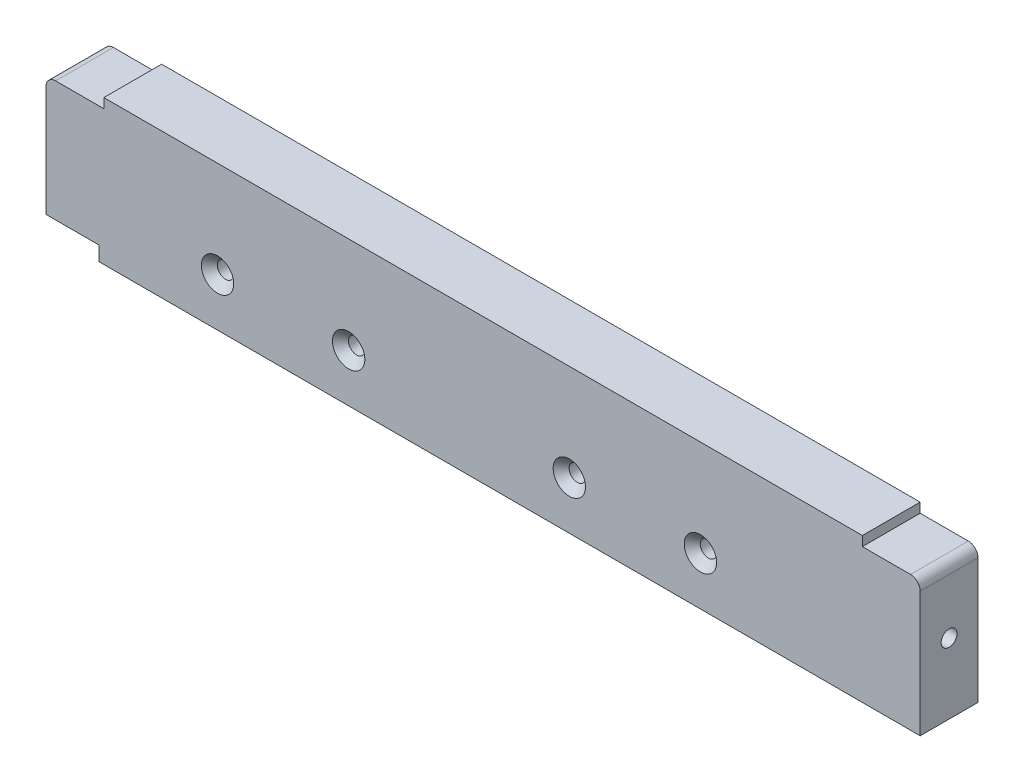
ISO-10303-21;
HEADER;
FILE_DESCRIPTION(('STEP AP214'),'2;1');
FILE_NAME('part.step','',(''),(''),'','','');
FILE_SCHEMA(('AUTOMOTIVE_DESIGN { 1 0 10303 214 1 1 1 1 }'));
ENDSEC;
DATA;
#1=APPLICATION_CONTEXT('core data for automotive mechanical design processes');
#2=APPLICATION_PROTOCOL_DEFINITION('international standard','automotive_design',2000,#1);
#3=PRODUCT_CONTEXT('',#1,'mechanical');
#4=PRODUCT('Part','Part','',(#3));
#5=PRODUCT_RELATED_PRODUCT_CATEGORY('part','',(#4));
#6=PRODUCT_DEFINITION_FORMATION('','',#4);
#7=PRODUCT_DEFINITION_CONTEXT('part definition',#1,'design');
#8=PRODUCT_DEFINITION('design','',#6,#7);
#9=PRODUCT_DEFINITION_SHAPE('','',#8);
#10=(LENGTH_UNIT() NAMED_UNIT(*) SI_UNIT(.MILLI.,.METRE.));
#11=(NAMED_UNIT(*) PLANE_ANGLE_UNIT() SI_UNIT($,.RADIAN.));
#12=(NAMED_UNIT(*) SI_UNIT($,.STERADIAN.) SOLID_ANGLE_UNIT());
#13=UNCERTAINTY_MEASURE_WITH_UNIT(LENGTH_MEASURE(1.E-05),#10,'distance_accuracy_value','');
#14=(GEOMETRIC_REPRESENTATION_CONTEXT(3) GLOBAL_UNCERTAINTY_ASSIGNED_CONTEXT((#13)) GLOBAL_UNIT_ASSIGNED_CONTEXT((#10,
#11,#12)) REPRESENTATION_CONTEXT('',''));
#15=CARTESIAN_POINT('',(0.,0.,0.));
#16=DIRECTION('',(0.,0.,1.));
#17=DIRECTION('',(1.,0.,0.));
#18=AXIS2_PLACEMENT_3D('',#15,#16,#17);
#19=CARTESIAN_POINT('',(-89.0193885765125,199.92784972707,0.));
#20=DIRECTION('',(-1.,0.,0.));
#21=DIRECTION('',(0.,0.,1.));
#22=AXIS2_PLACEMENT_3D('',#19,#20,#21);
#23=PLANE('',#22);
#24=CARTESIAN_POINT('',(-89.0193885765125,184.67784972707,6.));
#25=DIRECTION('',(-1.,0.,0.));
#26=DIRECTION('',(0.,0.,1.));
#27=AXIS2_PLACEMENT_3D('',#24,#25,#26);
#28=CIRCLE('',#27,1.64999999999998);
#29=CARTESIAN_POINT('',(-89.0193885765125,184.67784972707,7.64999999999999));
#30=VERTEX_POINT('',#29);
#31=EDGE_CURVE('E156',#30,#30,#28,.T.);
#32=ORIENTED_EDGE('',*,*,#31,.F.);
#33=EDGE_LOOP('',(#32));
#34=FACE_BOUND('',#33,.T.);
#35=DIRECTION('',(0.,0.,-1.));
#36=VECTOR('',#35,1.);
#37=CARTESIAN_POINT('',(-89.0193885765125,172.92784972707,0.));
#38=LINE('',#37,#36);
#39=CARTESIAN_POINT('',(-89.0193885765125,172.92784972707,12.));
#40=VERTEX_POINT('',#39);
#41=CARTESIAN_POINT('',(-89.0193885765125,172.92784972707,0.));
#42=VERTEX_POINT('',#41);
#43=EDGE_CURVE('E164',#40,#42,#38,.T.);
#44=ORIENTED_EDGE('',*,*,#43,.F.);
#45=DIRECTION('',(0.,-1.,0.));
#46=VECTOR('',#45,1.);
#47=CARTESIAN_POINT('',(-89.0193885765125,199.92784972707,12.));
#48=LINE('',#47,#46);
#49=CARTESIAN_POINT('',(-89.0193885765125,195.92784972707,12.));
#50=VERTEX_POINT('',#49);
#51=EDGE_CURVE('E204',#50,#40,#48,.T.);
#52=ORIENTED_EDGE('',*,*,#51,.F.);
#53=DIRECTION('',(0.,0.,1.));
#54=VECTOR('',#53,1.);
#55=CARTESIAN_POINT('',(-89.0193885765125,195.92784972707,0.));
#56=LINE('',#55,#54);
#57=CARTESIAN_POINT('',(-89.0193885765125,195.92784972707,0.));
#58=VERTEX_POINT('',#57);
#59=EDGE_CURVE('E259',#50,#58,#56,.F.);
#60=ORIENTED_EDGE('',*,*,#59,.T.);
#61=DIRECTION('',(0.,-1.,0.));
#62=VECTOR('',#61,1.);
#63=CARTESIAN_POINT('',(-89.0193885765125,199.92784972707,0.));
#64=LINE('',#63,#62);
#65=EDGE_CURVE('E205',#58,#42,#64,.T.);
#66=ORIENTED_EDGE('',*,*,#65,.T.);
#67=EDGE_LOOP('',(#44,#52,#60,#66));
#68=FACE_BOUND('',#67,.T.);
#69=ADVANCED_FACE('F35',(#34,#68),#23,.T.);
#70=CARTESIAN_POINT('',(-62.8193885765124,169.92784972707,12.));
#71=DIRECTION('',(0.,1.,0.));
#72=DIRECTION('',(0.,0.,1.));
#73=AXIS2_PLACEMENT_3D('',#70,#71,#72);
#74=PLANE('',#73);
#75=DIRECTION('',(1.,0.,0.));
#76=VECTOR('',#75,1.);
#77=CARTESIAN_POINT('',(-62.8193885765124,169.92784972707,12.));
#78=LINE('',#77,#76);
#79=CARTESIAN_POINT('',(-78.0193885765125,169.92784972707,12.));
#80=VERTEX_POINT('',#79);
#81=CARTESIAN_POINT('',(92.3806114234876,169.92784972707,12.));
#82=VERTEX_POINT('',#81);
#83=EDGE_CURVE('E247',#80,#82,#78,.T.);
#84=ORIENTED_EDGE('',*,*,#83,.F.);
#85=DIRECTION('',(0.,0.,1.));
#86=VECTOR('',#85,1.);
#87=CARTESIAN_POINT('',(-78.0193885765125,169.92784972707,0.));
#88=LINE('',#87,#86);
#89=CARTESIAN_POINT('',(-78.0193885765125,169.92784972707,0.));
#90=VERTEX_POINT('',#89);
#91=EDGE_CURVE('E163',#90,#80,#88,.T.);
#92=ORIENTED_EDGE('',*,*,#91,.F.);
#93=DIRECTION('',(1.,0.,0.));
#94=VECTOR('',#93,1.);
#95=CARTESIAN_POINT('',(-62.8193885765124,169.92784972707,0.));
#96=LINE('',#95,#94);
#97=CARTESIAN_POINT('',(92.3806114234876,169.92784972707,0.));
#98=VERTEX_POINT('',#97);
#99=EDGE_CURVE('E246',#90,#98,#96,.T.);
#100=ORIENTED_EDGE('',*,*,#99,.T.);
#101=DIRECTION('',(0.,0.,-1.));
#102=VECTOR('',#101,1.);
#103=CARTESIAN_POINT('',(92.3806114234876,169.92784972707,12.));
#104=LINE('',#103,#102);
#105=EDGE_CURVE('E200',#82,#98,#104,.T.);
#106=ORIENTED_EDGE('',*,*,#105,.F.);
#107=EDGE_LOOP('',(#84,#92,#100,#106));
#108=FACE_BOUND('',#107,.T.);
#109=ADVANCED_FACE('F314',(#108),#74,.F.);
#110=CARTESIAN_POINT('',(-62.8193885765125,199.92784972707,12.));
#111=DIRECTION('',(0.,-1.,0.));
#112=DIRECTION('',(0.,0.,-1.));
#113=AXIS2_PLACEMENT_3D('',#110,#111,#112);
#114=PLANE('',#113);
#115=DIRECTION('',(-1.,0.,0.));
#116=VECTOR('',#115,1.);
#117=CARTESIAN_POINT('',(-62.8193885765125,199.92784972707,12.));
#118=LINE('',#117,#116);
#119=CARTESIAN_POINT('',(80.3806114234876,199.92784972707,12.));
#120=VERTEX_POINT('',#119);
#121=CARTESIAN_POINT('',(-77.0193885765125,199.92784972707,12.));
#122=VERTEX_POINT('',#121);
#123=EDGE_CURVE('E249',#120,#122,#118,.T.);
#124=ORIENTED_EDGE('',*,*,#123,.F.);
#125=DIRECTION('',(0.,0.,1.));
#126=VECTOR('',#125,1.);
#127=CARTESIAN_POINT('',(80.3806114234876,199.92784972707,0.));
#128=LINE('',#127,#126);
#129=CARTESIAN_POINT('',(80.3806114234876,199.92784972707,0.));
#130=VERTEX_POINT('',#129);
#131=EDGE_CURVE('E137',#130,#120,#128,.T.);
#132=ORIENTED_EDGE('',*,*,#131,.F.);
#133=DIRECTION('',(-1.,0.,0.));
#134=VECTOR('',#133,1.);
#135=CARTESIAN_POINT('',(-62.8193885765125,199.92784972707,0.));
#136=LINE('',#135,#134);
#137=CARTESIAN_POINT('',(-77.0193885765125,199.92784972707,0.));
#138=VERTEX_POINT('',#137);
#139=EDGE_CURVE('E250',#130,#138,#136,.T.);
#140=ORIENTED_EDGE('',*,*,#139,.T.);
#141=DIRECTION('',(0.,0.,-1.));
#142=VECTOR('',#141,1.);
#143=CARTESIAN_POINT('',(-77.0193885765125,199.92784972707,0.));
#144=LINE('',#143,#142);
#145=EDGE_CURVE('E179',#122,#138,#144,.T.);
#146=ORIENTED_EDGE('',*,*,#145,.F.);
#147=EDGE_LOOP('',(#124,#132,#140,#146));
#148=FACE_BOUND('',#147,.T.);
#149=ADVANCED_FACE('F281',(#148),#114,.F.);
#150=CARTESIAN_POINT('',(-62.8193885765124,169.92784972707,12.));
#151=DIRECTION('',(0.,0.,1.));
#152=DIRECTION('',(1.,0.,0.));
#153=AXIS2_PLACEMENT_3D('',#150,#151,#152);
#154=PLANE('',#153);
#155=DIRECTION('',(0.,1.,0.));
#156=VECTOR('',#155,1.);
#157=CARTESIAN_POINT('',(92.3806114234876,199.92784972707,12.));
#158=LINE('',#157,#156);
#159=CARTESIAN_POINT('',(92.3806114234876,195.92784972707,12.));
#160=VERTEX_POINT('',#159);
#161=EDGE_CURVE('E198',#82,#160,#158,.T.);
#162=ORIENTED_EDGE('',*,*,#161,.T.);
#163=CARTESIAN_POINT('',(90.3806114234876,195.92784972707,12.));
#164=DIRECTION('',(0.,0.,1.));
#165=DIRECTION('',(1.,0.,0.));
#166=AXIS2_PLACEMENT_3D('',#163,#164,#165);
#167=CIRCLE('',#166,2.);
#168=CARTESIAN_POINT('',(90.3806114234876,197.92784972707,12.));
#169=VERTEX_POINT('',#168);
#170=EDGE_CURVE('E11',#160,#169,#167,.T.);
#171=ORIENTED_EDGE('',*,*,#170,.T.);
#172=DIRECTION('',(1.,0.,0.));
#173=VECTOR('',#172,1.);
#174=CARTESIAN_POINT('',(92.3806114234876,197.92784972707,12.));
#175=LINE('',#174,#173);
#176=CARTESIAN_POINT('',(80.3806114234876,197.92784972707,12.));
#177=VERTEX_POINT('',#176);
#178=EDGE_CURVE('E149',#177,#169,#175,.T.);
#179=ORIENTED_EDGE('',*,*,#178,.F.);
#180=DIRECTION('',(0.,1.,0.));
#181=VECTOR('',#180,1.);
#182=CARTESIAN_POINT('',(80.3806114234876,197.92784972707,12.));
#183=LINE('',#182,#181);
#184=EDGE_CURVE('E153',#177,#120,#183,.T.);
#185=ORIENTED_EDGE('',*,*,#184,.T.);
#186=ORIENTED_EDGE('',*,*,#123,.T.);
#187=DIRECTION('',(0.,1.,0.));
#188=VECTOR('',#187,1.);
#189=CARTESIAN_POINT('',(-77.0193885765125,197.92784972707,12.));
#190=LINE('',#189,#188);
#191=CARTESIAN_POINT('',(-77.0193885765125,197.92784972707,12.));
#192=VERTEX_POINT('',#191);
#193=EDGE_CURVE('E189',#192,#122,#190,.T.);
#194=ORIENTED_EDGE('',*,*,#193,.F.);
#195=DIRECTION('',(1.,0.,0.));
#196=VECTOR('',#195,1.);
#197=CARTESIAN_POINT('',(-89.0193885765125,197.92784972707,12.));
#198=LINE('',#197,#196);
#199=CARTESIAN_POINT('',(-87.0193885765125,197.92784972707,12.));
#200=VERTEX_POINT('',#199);
#201=EDGE_CURVE('E181',#200,#192,#198,.T.);
#202=ORIENTED_EDGE('',*,*,#201,.F.);
#203=CARTESIAN_POINT('',(-87.0193885765125,195.92784972707,12.));
#204=DIRECTION('',(0.,0.,1.));
#205=DIRECTION('',(1.,0.,0.));
#206=AXIS2_PLACEMENT_3D('',#203,#204,#205);
#207=CIRCLE('',#206,2.);
#208=EDGE_CURVE('E257',#200,#50,#207,.T.);
#209=ORIENTED_EDGE('',*,*,#208,.T.);
#210=ORIENTED_EDGE('',*,*,#51,.T.);
#211=DIRECTION('',(-1.,0.,0.));
#212=VECTOR('',#211,1.);
#213=CARTESIAN_POINT('',(-89.0193885765125,172.92784972707,12.));
#214=LINE('',#213,#212);
#215=CARTESIAN_POINT('',(-78.0193885765125,172.92784972707,12.));
#216=VERTEX_POINT('',#215);
#217=EDGE_CURVE('E172',#216,#40,#214,.T.);
#218=ORIENTED_EDGE('',*,*,#217,.F.);
#219=DIRECTION('',(0.,-1.,0.));
#220=VECTOR('',#219,1.);
#221=CARTESIAN_POINT('',(-78.0193885765125,172.92784972707,12.));
#222=LINE('',#221,#220);
#223=EDGE_CURVE('E176',#216,#80,#222,.T.);
#224=ORIENTED_EDGE('',*,*,#223,.T.);
#225=ORIENTED_EDGE('',*,*,#83,.T.);
#226=EDGE_LOOP('',(#162,#171,#179,#185,#186,#194,#202,#209,#210,#218,#224,#225));
#227=FACE_BOUND('',#226,.T.);
#228=CARTESIAN_POINT('',(46.7806114234876,179.92784972707,12.));
#229=DIRECTION('',(0.,0.,1.));
#230=DIRECTION('',(1.,0.,0.));
#231=AXIS2_PLACEMENT_3D('',#228,#229,#230);
#232=CIRCLE('',#231,3.36);
#233=CARTESIAN_POINT('',(50.1406114234876,179.92784972707,12.));
#234=VERTEX_POINT('',#233);
#235=EDGE_CURVE('E208',#234,#234,#232,.T.);
#236=ORIENTED_EDGE('',*,*,#235,.F.);
#237=EDGE_LOOP('',(#236));
#238=FACE_BOUND('',#237,.T.);
#239=CARTESIAN_POINT('',(-53.4193885765125,179.92784972707,12.));
#240=DIRECTION('',(0.,0.,1.));
#241=DIRECTION('',(1.,0.,0.));
#242=AXIS2_PLACEMENT_3D('',#239,#240,#241);
#243=CIRCLE('',#242,3.36);
#244=CARTESIAN_POINT('',(-50.0593885765125,179.92784972707,12.));
#245=VERTEX_POINT('',#244);
#246=EDGE_CURVE('E219',#245,#245,#243,.T.);
#247=ORIENTED_EDGE('',*,*,#246,.F.);
#248=EDGE_LOOP('',(#247));
#249=FACE_BOUND('',#248,.T.);
#250=CARTESIAN_POINT('',(-26.2193885765125,179.92784972707,12.));
#251=DIRECTION('',(0.,0.,1.));
#252=DIRECTION('',(1.,0.,0.));
#253=AXIS2_PLACEMENT_3D('',#250,#251,#252);
#254=CIRCLE('',#253,3.36);
#255=CARTESIAN_POINT('',(-22.8593885765125,179.92784972707,12.));
#256=VERTEX_POINT('',#255);
#257=EDGE_CURVE('E228',#256,#256,#254,.T.);
#258=ORIENTED_EDGE('',*,*,#257,.F.);
#259=EDGE_LOOP('',(#258));
#260=FACE_BOUND('',#259,.T.);
#261=CARTESIAN_POINT('',(19.5806114234876,179.92784972707,12.));
#262=DIRECTION('',(0.,0.,1.));
#263=DIRECTION('',(1.,0.,0.));
#264=AXIS2_PLACEMENT_3D('',#261,#262,#263);
#265=CIRCLE('',#264,3.36);
#266=CARTESIAN_POINT('',(22.9406114234876,179.92784972707,12.));
#267=VERTEX_POINT('',#266);
#268=EDGE_CURVE('E237',#267,#267,#265,.T.);
#269=ORIENTED_EDGE('',*,*,#268,.F.);
#270=EDGE_LOOP('',(#269));
#271=FACE_BOUND('',#270,.T.);
#272=ADVANCED_FACE('F285',(#227,#238,#249,#260,#271),#154,.T.);
#273=CARTESIAN_POINT('',(-62.8193885765124,169.92784972707,0.));
#274=DIRECTION('',(0.,0.,1.));
#275=DIRECTION('',(1.,0.,0.));
#276=AXIS2_PLACEMENT_3D('',#273,#274,#275);
#277=PLANE('',#276);
#278=CARTESIAN_POINT('',(46.7806114234876,179.92784972707,0.));
#279=DIRECTION('',(0.,0.,1.));
#280=DIRECTION('',(1.,0.,0.));
#281=AXIS2_PLACEMENT_3D('',#278,#279,#280);
#282=CIRCLE('',#281,1.69999999999999);
#283=CARTESIAN_POINT('',(48.4806114234876,179.92784972707,0.));
#284=VERTEX_POINT('',#283);
#285=EDGE_CURVE('E216',#284,#284,#282,.T.);
#286=ORIENTED_EDGE('',*,*,#285,.T.);
#287=EDGE_LOOP('',(#286));
#288=FACE_BOUND('',#287,.T.);
#289=CARTESIAN_POINT('',(-53.4193885765125,179.92784972707,0.));
#290=DIRECTION('',(0.,0.,1.));
#291=DIRECTION('',(1.,0.,0.));
#292=AXIS2_PLACEMENT_3D('',#289,#290,#291);
#293=CIRCLE('',#292,1.69999999999999);
#294=CARTESIAN_POINT('',(-51.7193885765125,179.92784972707,0.));
#295=VERTEX_POINT('',#294);
#296=EDGE_CURVE('E225',#295,#295,#293,.T.);
#297=ORIENTED_EDGE('',*,*,#296,.T.);
#298=EDGE_LOOP('',(#297));
#299=FACE_BOUND('',#298,.T.);
#300=CARTESIAN_POINT('',(-26.2193885765125,179.92784972707,0.));
#301=DIRECTION('',(0.,0.,1.));
#302=DIRECTION('',(1.,0.,0.));
#303=AXIS2_PLACEMENT_3D('',#300,#301,#302);
#304=CIRCLE('',#303,1.69999999999999);
#305=CARTESIAN_POINT('',(-24.5193885765125,179.92784972707,0.));
#306=VERTEX_POINT('',#305);
#307=EDGE_CURVE('E234',#306,#306,#304,.T.);
#308=ORIENTED_EDGE('',*,*,#307,.T.);
#309=EDGE_LOOP('',(#308));
#310=FACE_BOUND('',#309,.T.);
#311=CARTESIAN_POINT('',(19.5806114234876,179.92784972707,0.));
#312=DIRECTION('',(0.,0.,1.));
#313=DIRECTION('',(1.,0.,0.));
#314=AXIS2_PLACEMENT_3D('',#311,#312,#313);
#315=CIRCLE('',#314,1.69999999999999);
#316=CARTESIAN_POINT('',(21.2806114234875,179.92784972707,0.));
#317=VERTEX_POINT('',#316);
#318=EDGE_CURVE('E243',#317,#317,#315,.T.);
#319=ORIENTED_EDGE('',*,*,#318,.T.);
#320=EDGE_LOOP('',(#319));
#321=FACE_BOUND('',#320,.T.);
#322=DIRECTION('',(-1.,0.,0.));
#323=VECTOR('',#322,1.);
#324=CARTESIAN_POINT('',(92.3806114234876,197.92784972707,0.));
#325=LINE('',#324,#323);
#326=CARTESIAN_POINT('',(90.3806114234876,197.92784972707,0.));
#327=VERTEX_POINT('',#326);
#328=CARTESIAN_POINT('',(80.3806114234876,197.92784972707,0.));
#329=VERTEX_POINT('',#328);
#330=EDGE_CURVE('E140',#327,#329,#325,.T.);
#331=ORIENTED_EDGE('',*,*,#330,.F.);
#332=CARTESIAN_POINT('',(90.3806114234876,195.92784972707,0.));
#333=DIRECTION('',(0.,0.,1.));
#334=DIRECTION('',(1.,0.,0.));
#335=AXIS2_PLACEMENT_3D('',#332,#333,#334);
#336=CIRCLE('',#335,2.);
#337=CARTESIAN_POINT('',(92.3806114234876,195.92784972707,0.));
#338=VERTEX_POINT('',#337);
#339=EDGE_CURVE('E57',#327,#338,#336,.F.);
#340=ORIENTED_EDGE('',*,*,#339,.T.);
#341=DIRECTION('',(0.,1.,0.));
#342=VECTOR('',#341,1.);
#343=CARTESIAN_POINT('',(92.3806114234876,199.92784972707,0.));
#344=LINE('',#343,#342);
#345=EDGE_CURVE('E195',#98,#338,#344,.T.);
#346=ORIENTED_EDGE('',*,*,#345,.F.);
#347=ORIENTED_EDGE('',*,*,#99,.F.);
#348=DIRECTION('',(0.,-1.,0.));
#349=VECTOR('',#348,1.);
#350=CARTESIAN_POINT('',(-78.0193885765125,172.92784972707,0.));
#351=LINE('',#350,#349);
#352=CARTESIAN_POINT('',(-78.0193885765125,172.92784972707,0.));
#353=VERTEX_POINT('',#352);
#354=EDGE_CURVE('E174',#353,#90,#351,.T.);
#355=ORIENTED_EDGE('',*,*,#354,.F.);
#356=DIRECTION('',(1.,0.,0.));
#357=VECTOR('',#356,1.);
#358=CARTESIAN_POINT('',(-89.0193885765125,172.92784972707,0.));
#359=LINE('',#358,#357);
#360=EDGE_CURVE('E166',#42,#353,#359,.T.);
#361=ORIENTED_EDGE('',*,*,#360,.F.);
#362=ORIENTED_EDGE('',*,*,#65,.F.);
#363=CARTESIAN_POINT('',(-87.0193885765125,195.92784972707,0.));
#364=DIRECTION('',(0.,0.,1.));
#365=DIRECTION('',(1.,0.,0.));
#366=AXIS2_PLACEMENT_3D('',#363,#364,#365);
#367=CIRCLE('',#366,2.);
#368=CARTESIAN_POINT('',(-87.0193885765125,197.92784972707,0.));
#369=VERTEX_POINT('',#368);
#370=EDGE_CURVE('E261',#58,#369,#367,.F.);
#371=ORIENTED_EDGE('',*,*,#370,.T.);
#372=DIRECTION('',(-1.,0.,0.));
#373=VECTOR('',#372,1.);
#374=CARTESIAN_POINT('',(-89.0193885765125,197.92784972707,0.));
#375=LINE('',#374,#373);
#376=CARTESIAN_POINT('',(-77.0193885765125,197.92784972707,0.));
#377=VERTEX_POINT('',#376);
#378=EDGE_CURVE('E186',#377,#369,#375,.T.);
#379=ORIENTED_EDGE('',*,*,#378,.F.);
#380=DIRECTION('',(0.,1.,0.));
#381=VECTOR('',#380,1.);
#382=CARTESIAN_POINT('',(-77.0193885765125,197.92784972707,0.));
#383=LINE('',#382,#381);
#384=EDGE_CURVE('E192',#377,#138,#383,.T.);
#385=ORIENTED_EDGE('',*,*,#384,.T.);
#386=ORIENTED_EDGE('',*,*,#139,.F.);
#387=DIRECTION('',(0.,1.,0.));
#388=VECTOR('',#387,1.);
#389=CARTESIAN_POINT('',(80.3806114234876,197.92784972707,0.));
#390=LINE('',#389,#388);
#391=EDGE_CURVE('E151',#329,#130,#390,.T.);
#392=ORIENTED_EDGE('',*,*,#391,.F.);
#393=EDGE_LOOP('',(#331,#340,#346,#347,#355,#361,#362,#371,#379,#385,#386,#392));
#394=FACE_BOUND('',#393,.T.);
#395=ADVANCED_FACE('F274',(#288,#299,#310,#321,#394),#277,.F.);
#396=CARTESIAN_POINT('',(19.5806114234876,179.92784972707,12.));
#397=DIRECTION('',(0.,0.,1.));
#398=DIRECTION('',(1.,0.,0.));
#399=AXIS2_PLACEMENT_3D('',#396,#397,#398);
#400=CYLINDRICAL_SURFACE('',#399,1.69999999999999);
#401=ORIENTED_EDGE('',*,*,#318,.F.);
#402=EDGE_LOOP('',(#401));
#403=FACE_BOUND('',#402,.T.);
#404=CARTESIAN_POINT('',(19.5806114234876,179.92784972707,10.34));
#405=DIRECTION('',(0.,0.,1.));
#406=DIRECTION('',(1.,0.,0.));
#407=AXIS2_PLACEMENT_3D('',#404,#405,#406);
#408=CIRCLE('',#407,1.7);
#409=CARTESIAN_POINT('',(21.2806114234876,179.92784972707,10.34));
#410=VERTEX_POINT('',#409);
#411=EDGE_CURVE('E240',#410,#410,#408,.T.);
#412=ORIENTED_EDGE('',*,*,#411,.T.);
#413=EDGE_LOOP('',(#412));
#414=FACE_BOUND('',#413,.T.);
#415=ADVANCED_FACE('F360',(#403,#414),#400,.F.);
#416=CARTESIAN_POINT('',(19.5806114234876,179.92784972707,12.));
#417=DIRECTION('',(0.,0.,1.));
#418=DIRECTION('',(1.,0.,0.));
#419=AXIS2_PLACEMENT_3D('',#416,#417,#418);
#420=CONICAL_SURFACE('',#419,3.36,0.78539816339745);
#421=ORIENTED_EDGE('',*,*,#411,.F.);
#422=EDGE_LOOP('',(#421));
#423=FACE_BOUND('',#422,.T.);
#424=ORIENTED_EDGE('',*,*,#268,.T.);
#425=EDGE_LOOP('',(#424));
#426=FACE_BOUND('',#425,.T.);
#427=ADVANCED_FACE('F356',(#423,#426),#420,.F.);
#428=CARTESIAN_POINT('',(-26.2193885765125,179.92784972707,12.));
#429=DIRECTION('',(0.,0.,1.));
#430=DIRECTION('',(1.,0.,0.));
#431=AXIS2_PLACEMENT_3D('',#428,#429,#430);
#432=CYLINDRICAL_SURFACE('',#431,1.69999999999999);
#433=ORIENTED_EDGE('',*,*,#307,.F.);
#434=EDGE_LOOP('',(#433));
#435=FACE_BOUND('',#434,.T.);
#436=CARTESIAN_POINT('',(-26.2193885765125,179.92784972707,10.34));
#437=DIRECTION('',(0.,0.,1.));
#438=DIRECTION('',(1.,0.,0.));
#439=AXIS2_PLACEMENT_3D('',#436,#437,#438);
#440=CIRCLE('',#439,1.7);
#441=CARTESIAN_POINT('',(-24.5193885765125,179.92784972707,10.34));
#442=VERTEX_POINT('',#441);
#443=EDGE_CURVE('E231',#442,#442,#440,.T.);
#444=ORIENTED_EDGE('',*,*,#443,.T.);
#445=EDGE_LOOP('',(#444));
#446=FACE_BOUND('',#445,.T.);
#447=ADVANCED_FACE('F352',(#435,#446),#432,.F.);
#448=CARTESIAN_POINT('',(-26.2193885765125,179.92784972707,12.));
#449=DIRECTION('',(0.,0.,1.));
#450=DIRECTION('',(1.,0.,0.));
#451=AXIS2_PLACEMENT_3D('',#448,#449,#450);
#452=CONICAL_SURFACE('',#451,3.36,0.78539816339745);
#453=ORIENTED_EDGE('',*,*,#443,.F.);
#454=EDGE_LOOP('',(#453));
#455=FACE_BOUND('',#454,.T.);
#456=ORIENTED_EDGE('',*,*,#257,.T.);
#457=EDGE_LOOP('',(#456));
#458=FACE_BOUND('',#457,.T.);
#459=ADVANCED_FACE('F348',(#455,#458),#452,.F.);
#460=CARTESIAN_POINT('',(-53.4193885765125,179.92784972707,12.));
#461=DIRECTION('',(0.,0.,1.));
#462=DIRECTION('',(1.,0.,0.));
#463=AXIS2_PLACEMENT_3D('',#460,#461,#462);
#464=CYLINDRICAL_SURFACE('',#463,1.7);
#465=ORIENTED_EDGE('',*,*,#296,.F.);
#466=EDGE_LOOP('',(#465));
#467=FACE_BOUND('',#466,.T.);
#468=CARTESIAN_POINT('',(-53.4193885765125,179.92784972707,10.34));
#469=DIRECTION('',(0.,0.,1.));
#470=DIRECTION('',(1.,0.,0.));
#471=AXIS2_PLACEMENT_3D('',#468,#469,#470);
#472=CIRCLE('',#471,1.7);
#473=CARTESIAN_POINT('',(-51.7193885765125,179.92784972707,10.34));
#474=VERTEX_POINT('',#473);
#475=EDGE_CURVE('E222',#474,#474,#472,.T.);
#476=ORIENTED_EDGE('',*,*,#475,.T.);
#477=EDGE_LOOP('',(#476));
#478=FACE_BOUND('',#477,.T.);
#479=ADVANCED_FACE('F344',(#467,#478),#464,.F.);
#480=CARTESIAN_POINT('',(-53.4193885765125,179.92784972707,12.));
#481=DIRECTION('',(0.,0.,1.));
#482=DIRECTION('',(1.,0.,0.));
#483=AXIS2_PLACEMENT_3D('',#480,#481,#482);
#484=CONICAL_SURFACE('',#483,3.36,0.785398163397449);
#485=ORIENTED_EDGE('',*,*,#475,.F.);
#486=EDGE_LOOP('',(#485));
#487=FACE_BOUND('',#486,.T.);
#488=ORIENTED_EDGE('',*,*,#246,.T.);
#489=EDGE_LOOP('',(#488));
#490=FACE_BOUND('',#489,.T.);
#491=ADVANCED_FACE('F340',(#487,#490),#484,.F.);
#492=CARTESIAN_POINT('',(46.7806114234876,179.92784972707,12.));
#493=DIRECTION('',(0.,0.,1.));
#494=DIRECTION('',(1.,0.,0.));
#495=AXIS2_PLACEMENT_3D('',#492,#493,#494);
#496=CYLINDRICAL_SURFACE('',#495,1.7);
#497=ORIENTED_EDGE('',*,*,#285,.F.);
#498=EDGE_LOOP('',(#497));
#499=FACE_BOUND('',#498,.T.);
#500=CARTESIAN_POINT('',(46.7806114234876,179.92784972707,10.34));
#501=DIRECTION('',(0.,0.,1.));
#502=DIRECTION('',(1.,0.,0.));
#503=AXIS2_PLACEMENT_3D('',#500,#501,#502);
#504=CIRCLE('',#503,1.7);
#505=CARTESIAN_POINT('',(48.4806114234876,179.92784972707,10.34));
#506=VERTEX_POINT('',#505);
#507=EDGE_CURVE('E213',#506,#506,#504,.T.);
#508=ORIENTED_EDGE('',*,*,#507,.T.);
#509=EDGE_LOOP('',(#508));
#510=FACE_BOUND('',#509,.T.);
#511=ADVANCED_FACE('F336',(#499,#510),#496,.F.);
#512=CARTESIAN_POINT('',(46.7806114234876,179.92784972707,12.));
#513=DIRECTION('',(0.,0.,1.));
#514=DIRECTION('',(1.,0.,0.));
#515=AXIS2_PLACEMENT_3D('',#512,#513,#514);
#516=CONICAL_SURFACE('',#515,3.36,0.785398163397449);
#517=ORIENTED_EDGE('',*,*,#507,.F.);
#518=EDGE_LOOP('',(#517));
#519=FACE_BOUND('',#518,.T.);
#520=ORIENTED_EDGE('',*,*,#235,.T.);
#521=EDGE_LOOP('',(#520));
#522=FACE_BOUND('',#521,.T.);
#523=ADVANCED_FACE('F334',(#519,#522),#516,.F.);
#524=CARTESIAN_POINT('',(92.3806114234876,199.92784972707,12.));
#525=DIRECTION('',(-1.,0.,0.));
#526=DIRECTION('',(0.,0.,1.));
#527=AXIS2_PLACEMENT_3D('',#524,#525,#526);
#528=PLANE('',#527);
#529=CARTESIAN_POINT('',(92.3806114234876,184.486290300135,5.99999999999999));
#530=DIRECTION('',(1.,0.,0.));
#531=DIRECTION('',(0.,0.,-1.));
#532=AXIS2_PLACEMENT_3D('',#529,#530,#531);
#533=CIRCLE('',#532,1.64999999999998);
#534=CARTESIAN_POINT('',(92.3806114234876,184.486290300135,4.35000000000001));
#535=VERTEX_POINT('',#534);
#536=EDGE_CURVE('E138',#535,#535,#533,.T.);
#537=ORIENTED_EDGE('',*,*,#536,.F.);
#538=EDGE_LOOP('',(#537));
#539=FACE_BOUND('',#538,.T.);
#540=ORIENTED_EDGE('',*,*,#345,.T.);
#541=DIRECTION('',(0.,0.,-1.));
#542=VECTOR('',#541,1.);
#543=CARTESIAN_POINT('',(92.3806114234876,195.92784972707,12.));
#544=LINE('',#543,#542);
#545=EDGE_CURVE('E43',#338,#160,#544,.F.);
#546=ORIENTED_EDGE('',*,*,#545,.T.);
#547=ORIENTED_EDGE('',*,*,#161,.F.);
#548=ORIENTED_EDGE('',*,*,#105,.T.);
#549=EDGE_LOOP('',(#540,#546,#547,#548));
#550=FACE_BOUND('',#549,.T.);
#551=ADVANCED_FACE('F332',(#539,#550),#528,.F.);
#552=CARTESIAN_POINT('',(-77.0193885765125,197.92784972707,0.));
#553=DIRECTION('',(1.,0.,0.));
#554=DIRECTION('',(0.,0.,-1.));
#555=AXIS2_PLACEMENT_3D('',#552,#553,#554);
#556=PLANE('',#555);
#557=ORIENTED_EDGE('',*,*,#145,.T.);
#558=ORIENTED_EDGE('',*,*,#384,.F.);
#559=DIRECTION('',(0.,0.,-1.));
#560=VECTOR('',#559,1.);
#561=CARTESIAN_POINT('',(-77.0193885765125,197.92784972707,0.));
#562=LINE('',#561,#560);
#563=EDGE_CURVE('E183',#192,#377,#562,.T.);
#564=ORIENTED_EDGE('',*,*,#563,.F.);
#565=ORIENTED_EDGE('',*,*,#193,.T.);
#566=EDGE_LOOP('',(#557,#558,#564,#565));
#567=FACE_BOUND('',#566,.T.);
#568=ADVANCED_FACE('F290',(#567),#556,.F.);
#569=CARTESIAN_POINT('',(-89.0193885765125,197.92784972707,12.));
#570=DIRECTION('',(0.,1.,0.));
#571=DIRECTION('',(0.,0.,1.));
#572=AXIS2_PLACEMENT_3D('',#569,#570,#571);
#573=PLANE('',#572);
#574=ORIENTED_EDGE('',*,*,#378,.T.);
#575=DIRECTION('',(0.,0.,1.));
#576=VECTOR('',#575,1.);
#577=CARTESIAN_POINT('',(-87.0193885765125,197.92784972707,12.));
#578=LINE('',#577,#576);
#579=EDGE_CURVE('E252',#369,#200,#578,.T.);
#580=ORIENTED_EDGE('',*,*,#579,.T.);
#581=ORIENTED_EDGE('',*,*,#201,.T.);
#582=ORIENTED_EDGE('',*,*,#563,.T.);
#583=EDGE_LOOP('',(#574,#580,#581,#582));
#584=FACE_BOUND('',#583,.T.);
#585=ADVANCED_FACE('F293',(#584),#573,.T.);
#586=CARTESIAN_POINT('',(-87.0193885765125,195.92784972707,12.));
#587=DIRECTION('',(0.,0.,1.));
#588=DIRECTION('',(1.,0.,0.));
#589=AXIS2_PLACEMENT_3D('',#586,#587,#588);
#590=CYLINDRICAL_SURFACE('',#589,2.);
#591=ORIENTED_EDGE('',*,*,#370,.F.);
#592=ORIENTED_EDGE('',*,*,#59,.F.);
#593=ORIENTED_EDGE('',*,*,#208,.F.);
#594=ORIENTED_EDGE('',*,*,#579,.F.);
#595=EDGE_LOOP('',(#591,#592,#593,#594));
#596=FACE_BOUND('',#595,.T.);
#597=ADVANCED_FACE('F300',(#596),#590,.T.);
#598=CARTESIAN_POINT('',(-78.0193885765125,172.92784972707,0.));
#599=DIRECTION('',(1.,0.,0.));
#600=DIRECTION('',(0.,0.,-1.));
#601=AXIS2_PLACEMENT_3D('',#598,#599,#600);
#602=PLANE('',#601);
#603=ORIENTED_EDGE('',*,*,#91,.T.);
#604=ORIENTED_EDGE('',*,*,#223,.F.);
#605=DIRECTION('',(0.,0.,1.));
#606=VECTOR('',#605,1.);
#607=CARTESIAN_POINT('',(-78.0193885765125,172.92784972707,0.));
#608=LINE('',#607,#606);
#609=EDGE_CURVE('E169',#353,#216,#608,.T.);
#610=ORIENTED_EDGE('',*,*,#609,.F.);
#611=ORIENTED_EDGE('',*,*,#354,.T.);
#612=EDGE_LOOP('',(#603,#604,#610,#611));
#613=FACE_BOUND('',#612,.T.);
#614=ADVANCED_FACE('F311',(#613),#602,.F.);
#615=CARTESIAN_POINT('',(-89.0193885765125,172.92784972707,12.));
#616=DIRECTION('',(0.,1.,0.));
#617=DIRECTION('',(0.,0.,1.));
#618=AXIS2_PLACEMENT_3D('',#615,#616,#617);
#619=PLANE('',#618);
#620=ORIENTED_EDGE('',*,*,#43,.T.);
#621=ORIENTED_EDGE('',*,*,#360,.T.);
#622=ORIENTED_EDGE('',*,*,#609,.T.);
#623=ORIENTED_EDGE('',*,*,#217,.T.);
#624=EDGE_LOOP('',(#620,#621,#622,#623));
#625=FACE_BOUND('',#624,.T.);
#626=ADVANCED_FACE('F306',(#625),#619,.F.);
#627=CARTESIAN_POINT('',(-79.0193885765125,184.67784972707,6.));
#628=DIRECTION('',(-1.,0.,0.));
#629=DIRECTION('',(0.,0.,1.));
#630=AXIS2_PLACEMENT_3D('',#627,#628,#629);
#631=CONICAL_SURFACE('',#630,1.64999999999998,1.02974425867665);
#632=CARTESIAN_POINT('',(-78.027968555117,184.67784972707,6.));
#633=VERTEX_POINT('',#632);
#634=VERTEX_LOOP('',#633);
#635=FACE_BOUND('',#634,.T.);
#636=CARTESIAN_POINT('',(-79.0193885765125,184.67784972707,6.));
#637=DIRECTION('',(-1.,0.,0.));
#638=DIRECTION('',(0.,0.,1.));
#639=AXIS2_PLACEMENT_3D('',#636,#637,#638);
#640=CIRCLE('',#639,1.64999999999998);
#641=CARTESIAN_POINT('',(-79.0193885765125,184.67784972707,7.64999999999999));
#642=VERTEX_POINT('',#641);
#643=EDGE_CURVE('E160',#642,#642,#640,.T.);
#644=ORIENTED_EDGE('',*,*,#643,.T.);
#645=EDGE_LOOP('',(#644));
#646=FACE_BOUND('',#645,.T.);
#647=ADVANCED_FACE('F384',(#635,#646),#631,.F.);
#648=CARTESIAN_POINT('',(-89.0193885765125,184.67784972707,6.));
#649=DIRECTION('',(-1.,0.,0.));
#650=DIRECTION('',(0.,0.,1.));
#651=AXIS2_PLACEMENT_3D('',#648,#649,#650);
#652=CYLINDRICAL_SURFACE('',#651,1.64999999999998);
#653=ORIENTED_EDGE('',*,*,#643,.F.);
#654=EDGE_LOOP('',(#653));
#655=FACE_BOUND('',#654,.T.);
#656=ORIENTED_EDGE('',*,*,#31,.T.);
#657=EDGE_LOOP('',(#656));
#658=FACE_BOUND('',#657,.T.);
#659=ADVANCED_FACE('F387',(#655,#658),#652,.F.);
#660=CARTESIAN_POINT('',(80.3806114234876,197.92784972707,0.));
#661=DIRECTION('',(-1.,0.,0.));
#662=DIRECTION('',(0.,0.,1.));
#663=AXIS2_PLACEMENT_3D('',#660,#661,#662);
#664=PLANE('',#663);
#665=ORIENTED_EDGE('',*,*,#131,.T.);
#666=ORIENTED_EDGE('',*,*,#184,.F.);
#667=DIRECTION('',(0.,0.,1.));
#668=VECTOR('',#667,1.);
#669=CARTESIAN_POINT('',(80.3806114234876,197.92784972707,0.));
#670=LINE('',#669,#668);
#671=EDGE_CURVE('E146',#329,#177,#670,.T.);
#672=ORIENTED_EDGE('',*,*,#671,.F.);
#673=ORIENTED_EDGE('',*,*,#391,.T.);
#674=EDGE_LOOP('',(#665,#666,#672,#673));
#675=FACE_BOUND('',#674,.T.);
#676=ADVANCED_FACE('F278',(#675),#664,.F.);
#677=CARTESIAN_POINT('',(92.3806114234876,197.92784972707,12.));
#678=DIRECTION('',(0.,-1.,0.));
#679=DIRECTION('',(0.,0.,-1.));
#680=AXIS2_PLACEMENT_3D('',#677,#678,#679);
#681=PLANE('',#680);
#682=ORIENTED_EDGE('',*,*,#178,.T.);
#683=DIRECTION('',(0.,0.,-1.));
#684=VECTOR('',#683,1.);
#685=CARTESIAN_POINT('',(90.3806114234876,197.92784972707,12.));
#686=LINE('',#685,#684);
#687=EDGE_CURVE('E263',#169,#327,#686,.T.);
#688=ORIENTED_EDGE('',*,*,#687,.T.);
#689=ORIENTED_EDGE('',*,*,#330,.T.);
#690=ORIENTED_EDGE('',*,*,#671,.T.);
#691=EDGE_LOOP('',(#682,#688,#689,#690));
#692=FACE_BOUND('',#691,.T.);
#693=ADVANCED_FACE('F268',(#692),#681,.F.);
#694=CARTESIAN_POINT('',(90.3806114234876,195.92784972707,12.));
#695=DIRECTION('',(0.,0.,-1.));
#696=DIRECTION('',(-1.,0.,0.));
#697=AXIS2_PLACEMENT_3D('',#694,#695,#696);
#698=CYLINDRICAL_SURFACE('',#697,2.);
#699=ORIENTED_EDGE('',*,*,#170,.F.);
#700=ORIENTED_EDGE('',*,*,#545,.F.);
#701=ORIENTED_EDGE('',*,*,#339,.F.);
#702=ORIENTED_EDGE('',*,*,#687,.F.);
#703=EDGE_LOOP('',(#699,#700,#701,#702));
#704=FACE_BOUND('',#703,.T.);
#705=ADVANCED_FACE('F37',(#704),#698,.T.);
#706=CARTESIAN_POINT('',(82.3806114234876,184.486290300135,5.99999999999999));
#707=DIRECTION('',(1.,0.,0.));
#708=DIRECTION('',(0.,0.,-1.));
#709=AXIS2_PLACEMENT_3D('',#706,#707,#708);
#710=CONICAL_SURFACE('',#709,1.64999999999998,1.02974425867665);
#711=CARTESIAN_POINT('',(81.3891914020921,184.486290300135,5.99999999999999));
#712=VERTEX_POINT('',#711);
#713=VERTEX_LOOP('',#712);
#714=FACE_BOUND('',#713,.T.);
#715=CARTESIAN_POINT('',(82.3806114234876,184.486290300135,5.99999999999999));
#716=DIRECTION('',(1.,0.,0.));
#717=DIRECTION('',(0.,0.,-1.));
#718=AXIS2_PLACEMENT_3D('',#715,#716,#717);
#719=CIRCLE('',#718,1.64999999999998);
#720=CARTESIAN_POINT('',(82.3806114234876,184.486290300135,4.35000000000001));
#721=VERTEX_POINT('',#720);
#722=EDGE_CURVE('E135',#721,#721,#719,.T.);
#723=ORIENTED_EDGE('',*,*,#722,.T.);
#724=EDGE_LOOP('',(#723));
#725=FACE_BOUND('',#724,.T.);
#726=ADVANCED_FACE('F128',(#714,#725),#710,.F.);
#727=CARTESIAN_POINT('',(92.3806114234876,184.486290300135,5.99999999999999));
#728=DIRECTION('',(1.,0.,0.));
#729=DIRECTION('',(0.,0.,-1.));
#730=AXIS2_PLACEMENT_3D('',#727,#728,#729);
#731=CYLINDRICAL_SURFACE('',#730,1.64999999999998);
#732=ORIENTED_EDGE('',*,*,#722,.F.);
#733=EDGE_LOOP('',(#732));
#734=FACE_BOUND('',#733,.T.);
#735=ORIENTED_EDGE('',*,*,#536,.T.);
#736=EDGE_LOOP('',(#735));
#737=FACE_BOUND('',#736,.T.);
#738=ADVANCED_FACE('F131',(#734,#737),#731,.F.);
#739=CLOSED_SHELL('',(#69,#109,#149,#272,#395,#415,#427,#447,#459,#479,#491,#511,#523,#551,#568,
#585,#597,#614,#626,#647,#659,#676,#693,#705,#726,#738));
#740=MANIFOLD_SOLID_BREP('B2',#739);
#741=ADVANCED_BREP_SHAPE_REPRESENTATION('',(#18,#740),#14);
#742=SHAPE_DEFINITION_REPRESENTATION(#9,#741);
ENDSEC;
END-ISO-10303-21;
